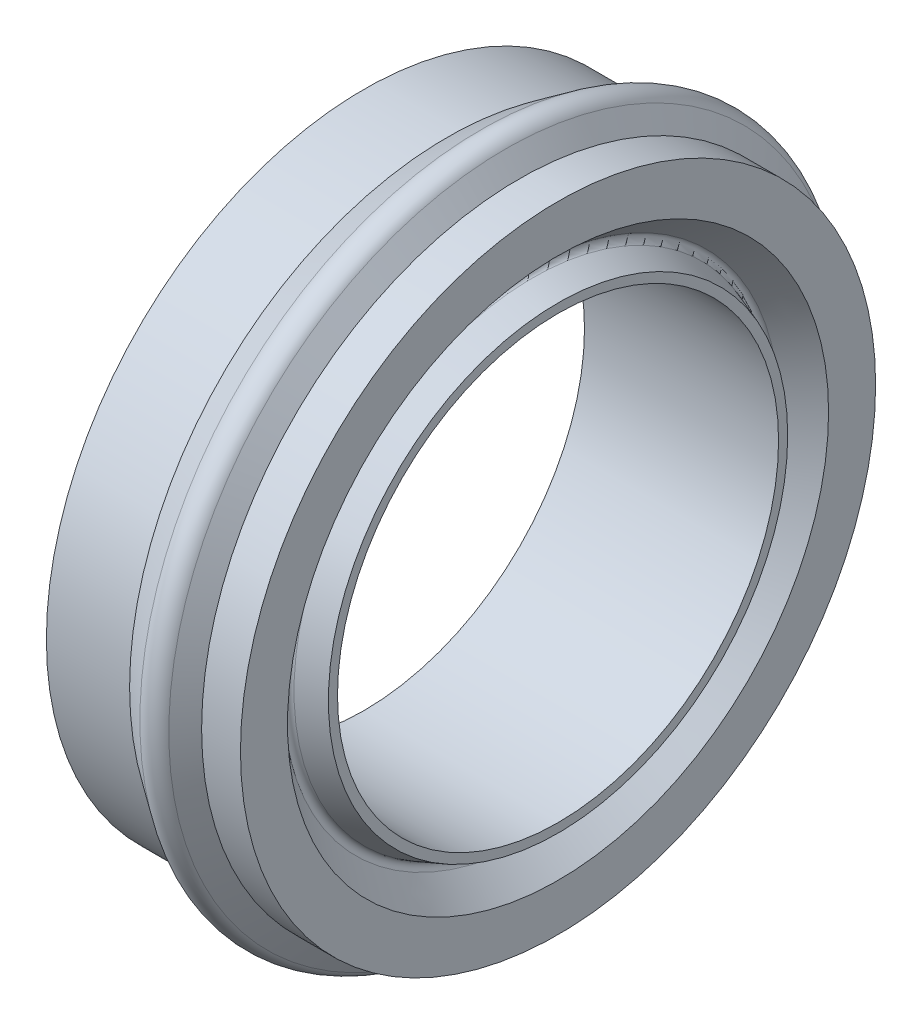
ISO-10303-21;
HEADER;
FILE_DESCRIPTION(('STEP AP214'),'2;1');
FILE_NAME('part.step','',(''),(''),'','','');
FILE_SCHEMA(('AUTOMOTIVE_DESIGN { 1 0 10303 214 1 1 1 1 }'));
ENDSEC;
DATA;
#1=APPLICATION_CONTEXT('core data for automotive mechanical design processes');
#2=APPLICATION_PROTOCOL_DEFINITION('international standard','automotive_design',2000,#1);
#3=PRODUCT_CONTEXT('',#1,'mechanical');
#4=PRODUCT('Part','Part','',(#3));
#5=PRODUCT_RELATED_PRODUCT_CATEGORY('part','',(#4));
#6=PRODUCT_DEFINITION_FORMATION('','',#4);
#7=PRODUCT_DEFINITION_CONTEXT('part definition',#1,'design');
#8=PRODUCT_DEFINITION('design','',#6,#7);
#9=PRODUCT_DEFINITION_SHAPE('','',#8);
#10=(LENGTH_UNIT() NAMED_UNIT(*) SI_UNIT(.MILLI.,.METRE.));
#11=(NAMED_UNIT(*) PLANE_ANGLE_UNIT() SI_UNIT($,.RADIAN.));
#12=(NAMED_UNIT(*) SI_UNIT($,.STERADIAN.) SOLID_ANGLE_UNIT());
#13=UNCERTAINTY_MEASURE_WITH_UNIT(LENGTH_MEASURE(1.E-05),#10,'distance_accuracy_value','');
#14=(GEOMETRIC_REPRESENTATION_CONTEXT(3) GLOBAL_UNCERTAINTY_ASSIGNED_CONTEXT((#13)) GLOBAL_UNIT_ASSIGNED_CONTEXT((#10,
#11,#12)) REPRESENTATION_CONTEXT('',''));
#15=CARTESIAN_POINT('',(0.,0.,0.));
#16=DIRECTION('',(0.,0.,1.));
#17=DIRECTION('',(1.,0.,0.));
#18=AXIS2_PLACEMENT_3D('',#15,#16,#17);
#19=CARTESIAN_POINT('',(12.8431908641816,0.,0.));
#20=DIRECTION('',(-1.,0.,0.));
#21=DIRECTION('',(0.,0.,1.));
#22=AXIS2_PLACEMENT_3D('',#19,#20,#21);
#23=CONICAL_SURFACE('',#22,16.7821846765844,0.721897734777882);
#24=CARTESIAN_POINT('',(15.2397348968309,0.,0.));
#25=DIRECTION('',(1.,0.,0.));
#26=DIRECTION('',(0.,0.,-1.));
#27=AXIS2_PLACEMENT_3D('',#24,#25,#26);
#28=CIRCLE('',#27,14.6721928607395);
#29=CARTESIAN_POINT('',(15.2397348968309,0.,-14.6721928607395));
#30=VERTEX_POINT('',#29);
#31=EDGE_CURVE('E83',#30,#30,#28,.T.);
#32=ORIENTED_EDGE('',*,*,#31,.T.);
#33=EDGE_LOOP('',(#32));
#34=FACE_BOUND('',#33,.T.);
#35=CARTESIAN_POINT('',(12.8431908641816,0.,0.));
#36=DIRECTION('',(1.,0.,0.));
#37=DIRECTION('',(0.,0.,-1.));
#38=AXIS2_PLACEMENT_3D('',#35,#36,#37);
#39=CIRCLE('',#38,16.7821846765844);
#40=CARTESIAN_POINT('',(12.8431908641816,0.,-16.7821846765844));
#41=VERTEX_POINT('',#40);
#42=EDGE_CURVE('E10',#41,#41,#39,.T.);
#43=ORIENTED_EDGE('',*,*,#42,.F.);
#44=EDGE_LOOP('',(#43));
#45=FACE_BOUND('',#44,.T.);
#46=ADVANCED_FACE('F31',(#34,#45),#23,.F.);
#47=CARTESIAN_POINT('',(12.8431908641816,18.,0.));
#48=DIRECTION('',(-1.,0.,0.));
#49=DIRECTION('',(0.,0.,1.));
#50=AXIS2_PLACEMENT_3D('',#47,#48,#49);
#51=PLANE('',#50);
#52=ORIENTED_EDGE('',*,*,#42,.T.);
#53=EDGE_LOOP('',(#52));
#54=FACE_BOUND('',#53,.T.);
#55=CARTESIAN_POINT('',(12.8431908641816,0.,0.));
#56=DIRECTION('',(1.,0.,0.));
#57=DIRECTION('',(0.,0.,-1.));
#58=AXIS2_PLACEMENT_3D('',#55,#56,#57);
#59=CIRCLE('',#58,18.);
#60=CARTESIAN_POINT('',(12.8431908641816,0.,-18.));
#61=VERTEX_POINT('',#60);
#62=EDGE_CURVE('E37',#61,#61,#59,.T.);
#63=ORIENTED_EDGE('',*,*,#62,.F.);
#64=EDGE_LOOP('',(#63));
#65=FACE_BOUND('',#64,.T.);
#66=ADVANCED_FACE('F101',(#54,#65),#51,.T.);
#67=CARTESIAN_POINT('',(29.1157823499387,0.,0.));
#68=DIRECTION('',(1.,0.,0.));
#69=DIRECTION('',(0.,0.,-1.));
#70=AXIS2_PLACEMENT_3D('',#67,#68,#69);
#71=CYLINDRICAL_SURFACE('',#70,18.);
#72=ORIENTED_EDGE('',*,*,#62,.T.);
#73=EDGE_LOOP('',(#72));
#74=FACE_BOUND('',#73,.T.);
#75=CARTESIAN_POINT('',(17.5598655159356,0.,0.));
#76=DIRECTION('',(1.,0.,0.));
#77=DIRECTION('',(0.,0.,-1.));
#78=AXIS2_PLACEMENT_3D('',#75,#76,#77);
#79=CIRCLE('',#78,18.);
#80=CARTESIAN_POINT('',(17.5598655159356,0.,-18.));
#81=VERTEX_POINT('',#80);
#82=EDGE_CURVE('E41',#81,#81,#79,.T.);
#83=ORIENTED_EDGE('',*,*,#82,.F.);
#84=EDGE_LOOP('',(#83));
#85=FACE_BOUND('',#84,.T.);
#86=ADVANCED_FACE('F105',(#74,#85),#71,.T.);
#87=CARTESIAN_POINT('',(19.4850863765066,0.,0.));
#88=DIRECTION('',(1.,0.,0.));
#89=DIRECTION('',(0.,0.,-1.));
#90=AXIS2_PLACEMENT_3D('',#87,#88,#89);
#91=CONICAL_SURFACE('',#90,19.3431712429728,0.609161333957169);
#92=ORIENTED_EDGE('',*,*,#82,.T.);
#93=EDGE_LOOP('',(#92));
#94=FACE_BOUND('',#93,.T.);
#95=CARTESIAN_POINT('',(19.4850863765066,0.,0.));
#96=DIRECTION('',(1.,0.,0.));
#97=DIRECTION('',(0.,0.,-1.));
#98=AXIS2_PLACEMENT_3D('',#95,#96,#97);
#99=CIRCLE('',#98,19.3431712429728);
#100=CARTESIAN_POINT('',(19.4850863765066,0.,-19.3431712429728));
#101=VERTEX_POINT('',#100);
#102=EDGE_CURVE('E45',#101,#101,#99,.T.);
#103=ORIENTED_EDGE('',*,*,#102,.F.);
#104=EDGE_LOOP('',(#103));
#105=FACE_BOUND('',#104,.T.);
#106=ADVANCED_FACE('F109',(#94,#105),#91,.T.);
#107=CARTESIAN_POINT('',(20.0572662242618,0.,0.));
#108=DIRECTION('',(1.,0.,0.));
#109=DIRECTION('',(0.,0.,-1.));
#110=AXIS2_PLACEMENT_3D('',#107,#108,#109);
#111=TOROIDAL_SURFACE('',#110,18.5230430689519,0.999999999999996);
#112=ORIENTED_EDGE('',*,*,#102,.T.);
#113=EDGE_LOOP('',(#112));
#114=FACE_BOUND('',#113,.T.);
#115=CARTESIAN_POINT('',(20.8773943982827,0.,0.));
#116=DIRECTION('',(1.,0.,0.));
#117=DIRECTION('',(0.,0.,-1.));
#118=AXIS2_PLACEMENT_3D('',#115,#116,#117);
#119=CIRCLE('',#118,19.0952229167071);
#120=CARTESIAN_POINT('',(20.8773943982827,0.,-19.0952229167071));
#121=VERTEX_POINT('',#120);
#122=EDGE_CURVE('E50',#121,#121,#119,.T.);
#123=ORIENTED_EDGE('',*,*,#122,.F.);
#124=EDGE_LOOP('',(#123));
#125=FACE_BOUND('',#124,.T.);
#126=ADVANCED_FACE('F115',(#114,#125),#111,.T.);
#127=CARTESIAN_POINT('',(21.6414999388436,0.,0.));
#128=DIRECTION('',(-1.,0.,0.));
#129=DIRECTION('',(0.,0.,1.));
#130=AXIS2_PLACEMENT_3D('',#127,#128,#129);
#131=CONICAL_SURFACE('',#130,18.,0.961634992837726);
#132=ORIENTED_EDGE('',*,*,#122,.T.);
#133=EDGE_LOOP('',(#132));
#134=FACE_BOUND('',#133,.T.);
#135=CARTESIAN_POINT('',(21.6414999388436,0.,0.));
#136=DIRECTION('',(1.,0.,0.));
#137=DIRECTION('',(0.,0.,-1.));
#138=AXIS2_PLACEMENT_3D('',#135,#136,#137);
#139=CIRCLE('',#138,18.);
#140=CARTESIAN_POINT('',(21.6414999388436,0.,-18.));
#141=VERTEX_POINT('',#140);
#142=EDGE_CURVE('E53',#141,#141,#139,.T.);
#143=ORIENTED_EDGE('',*,*,#142,.F.);
#144=EDGE_LOOP('',(#143));
#145=FACE_BOUND('',#144,.T.);
#146=ADVANCED_FACE('F119',(#134,#145),#131,.T.);
#147=CARTESIAN_POINT('',(29.1157823499387,0.,0.));
#148=DIRECTION('',(1.,0.,0.));
#149=DIRECTION('',(0.,0.,-1.));
#150=AXIS2_PLACEMENT_3D('',#147,#148,#149);
#151=CYLINDRICAL_SURFACE('',#150,18.);
#152=ORIENTED_EDGE('',*,*,#142,.T.);
#153=EDGE_LOOP('',(#152));
#154=FACE_BOUND('',#153,.T.);
#155=CARTESIAN_POINT('',(23.8431908641816,0.,0.));
#156=DIRECTION('',(1.,0.,0.));
#157=DIRECTION('',(0.,0.,-1.));
#158=AXIS2_PLACEMENT_3D('',#155,#156,#157);
#159=CIRCLE('',#158,18.);
#160=CARTESIAN_POINT('',(23.8431908641816,0.,-18.));
#161=VERTEX_POINT('',#160);
#162=EDGE_CURVE('E56',#161,#161,#159,.T.);
#163=ORIENTED_EDGE('',*,*,#162,.F.);
#164=EDGE_LOOP('',(#163));
#165=FACE_BOUND('',#164,.T.);
#166=ADVANCED_FACE('F123',(#154,#165),#151,.T.);
#167=CARTESIAN_POINT('',(23.8431908641816,15.3339387117938,0.));
#168=DIRECTION('',(1.,0.,0.));
#169=DIRECTION('',(0.,0.,-1.));
#170=AXIS2_PLACEMENT_3D('',#167,#168,#169);
#171=PLANE('',#170);
#172=ORIENTED_EDGE('',*,*,#162,.T.);
#173=EDGE_LOOP('',(#172));
#174=FACE_BOUND('',#173,.T.);
#175=CARTESIAN_POINT('',(23.8431908641816,0.,0.));
#176=DIRECTION('',(1.,0.,0.));
#177=DIRECTION('',(0.,0.,-1.));
#178=AXIS2_PLACEMENT_3D('',#175,#176,#177);
#179=CIRCLE('',#178,15.3339387117938);
#180=CARTESIAN_POINT('',(23.8431908641816,0.,-15.3339387117938));
#181=VERTEX_POINT('',#180);
#182=EDGE_CURVE('E59',#181,#181,#179,.T.);
#183=ORIENTED_EDGE('',*,*,#182,.F.);
#184=EDGE_LOOP('',(#183));
#185=FACE_BOUND('',#184,.T.);
#186=ADVANCED_FACE('F127',(#174,#185),#171,.T.);
#187=CARTESIAN_POINT('',(22.3229165200807,0.,0.));
#188=DIRECTION('',(1.,0.,0.));
#189=DIRECTION('',(0.,0.,-1.));
#190=AXIS2_PLACEMENT_3D('',#187,#188,#189);
#191=CONICAL_SURFACE('',#190,14.046297358895,0.702737949648893);
#192=ORIENTED_EDGE('',*,*,#182,.T.);
#193=EDGE_LOOP('',(#192));
#194=FACE_BOUND('',#193,.T.);
#195=CARTESIAN_POINT('',(22.3229165200807,0.,0.));
#196=DIRECTION('',(1.,0.,0.));
#197=DIRECTION('',(0.,0.,-1.));
#198=AXIS2_PLACEMENT_3D('',#195,#196,#197);
#199=CIRCLE('',#198,14.046297358895);
#200=CARTESIAN_POINT('',(22.3229165200807,0.,-14.046297358895));
#201=VERTEX_POINT('',#200);
#202=EDGE_CURVE('E62',#201,#201,#199,.T.);
#203=ORIENTED_EDGE('',*,*,#202,.F.);
#204=EDGE_LOOP('',(#203));
#205=FACE_BOUND('',#204,.T.);
#206=ADVANCED_FACE('F131',(#194,#205),#191,.F.);
#207=CARTESIAN_POINT('',(22.516809330893,0.,0.));
#208=DIRECTION('',(1.,0.,0.));
#209=DIRECTION('',(0.,0.,-1.));
#210=AXIS2_PLACEMENT_3D('',#207,#208,#209);
#211=TOROIDAL_SURFACE('',#210,13.817374712756,0.300000000000001);
#212=ORIENTED_EDGE('',*,*,#202,.T.);
#213=EDGE_LOOP('',(#212));
#214=FACE_BOUND('',#213,.T.);
#215=CARTESIAN_POINT('',(22.4145040662134,0.,0.));
#216=DIRECTION('',(1.,0.,0.));
#217=DIRECTION('',(0.,0.,-1.));
#218=AXIS2_PLACEMENT_3D('',#215,#216,#217);
#219=CIRCLE('',#218,13.5353576338071);
#220=CARTESIAN_POINT('',(22.4145040662134,0.,-13.5353576338071));
#221=VERTEX_POINT('',#220);
#222=EDGE_CURVE('E65',#221,#221,#219,.T.);
#223=ORIENTED_EDGE('',*,*,#222,.F.);
#224=EDGE_LOOP('',(#223));
#225=FACE_BOUND('',#224,.T.);
#226=ADVANCED_FACE('F135',(#214,#225),#211,.F.);
#227=CARTESIAN_POINT('',(23.8431908641816,0.,0.));
#228=DIRECTION('',(-1.,0.,0.));
#229=DIRECTION('',(0.,0.,1.));
#230=AXIS2_PLACEMENT_3D('',#227,#228,#229);
#231=CONICAL_SURFACE('',#230,13.0170834159649,0.347999118611848);
#232=ORIENTED_EDGE('',*,*,#222,.T.);
#233=EDGE_LOOP('',(#232));
#234=FACE_BOUND('',#233,.T.);
#235=CARTESIAN_POINT('',(23.8431908641816,0.,0.));
#236=DIRECTION('',(1.,0.,0.));
#237=DIRECTION('',(0.,0.,-1.));
#238=AXIS2_PLACEMENT_3D('',#235,#236,#237);
#239=CIRCLE('',#238,13.0170834159649);
#240=CARTESIAN_POINT('',(23.8431908641816,0.,-13.0170834159649));
#241=VERTEX_POINT('',#240);
#242=EDGE_CURVE('E68',#241,#241,#239,.T.);
#243=ORIENTED_EDGE('',*,*,#242,.F.);
#244=EDGE_LOOP('',(#243));
#245=FACE_BOUND('',#244,.T.);
#246=ADVANCED_FACE('F139',(#234,#245),#231,.T.);
#247=CARTESIAN_POINT('',(23.8431908641816,12.5,0.));
#248=DIRECTION('',(1.,0.,0.));
#249=DIRECTION('',(0.,0.,-1.));
#250=AXIS2_PLACEMENT_3D('',#247,#248,#249);
#251=PLANE('',#250);
#252=ORIENTED_EDGE('',*,*,#242,.T.);
#253=EDGE_LOOP('',(#252));
#254=FACE_BOUND('',#253,.T.);
#255=CARTESIAN_POINT('',(23.8431908641816,0.,0.));
#256=DIRECTION('',(1.,0.,0.));
#257=DIRECTION('',(0.,0.,-1.));
#258=AXIS2_PLACEMENT_3D('',#255,#256,#257);
#259=CIRCLE('',#258,12.5);
#260=CARTESIAN_POINT('',(23.8431908641816,0.,-12.5));
#261=VERTEX_POINT('',#260);
#262=EDGE_CURVE('E71',#261,#261,#259,.T.);
#263=ORIENTED_EDGE('',*,*,#262,.F.);
#264=EDGE_LOOP('',(#263));
#265=FACE_BOUND('',#264,.T.);
#266=ADVANCED_FACE('F143',(#254,#265),#251,.T.);
#267=CARTESIAN_POINT('',(29.1157823499387,0.,0.));
#268=DIRECTION('',(1.,0.,0.));
#269=DIRECTION('',(0.,0.,-1.));
#270=AXIS2_PLACEMENT_3D('',#267,#268,#269);
#271=CYLINDRICAL_SURFACE('',#270,12.5);
#272=ORIENTED_EDGE('',*,*,#262,.T.);
#273=EDGE_LOOP('',(#272));
#274=FACE_BOUND('',#273,.T.);
#275=CARTESIAN_POINT('',(12.8431908641816,0.,0.));
#276=DIRECTION('',(1.,0.,0.));
#277=DIRECTION('',(0.,0.,-1.));
#278=AXIS2_PLACEMENT_3D('',#275,#276,#277);
#279=CIRCLE('',#278,12.5);
#280=CARTESIAN_POINT('',(12.8431908641816,0.,-12.5));
#281=VERTEX_POINT('',#280);
#282=EDGE_CURVE('E74',#281,#281,#279,.T.);
#283=ORIENTED_EDGE('',*,*,#282,.F.);
#284=EDGE_LOOP('',(#283));
#285=FACE_BOUND('',#284,.T.);
#286=ADVANCED_FACE('F147',(#274,#285),#271,.F.);
#287=CARTESIAN_POINT('',(12.8431908641816,13.1656549011957,0.));
#288=DIRECTION('',(-1.,0.,0.));
#289=DIRECTION('',(0.,0.,1.));
#290=AXIS2_PLACEMENT_3D('',#287,#288,#289);
#291=PLANE('',#290);
#292=ORIENTED_EDGE('',*,*,#282,.T.);
#293=EDGE_LOOP('',(#292));
#294=FACE_BOUND('',#293,.T.);
#295=CARTESIAN_POINT('',(12.8431908641816,0.,0.));
#296=DIRECTION('',(1.,0.,0.));
#297=DIRECTION('',(0.,0.,-1.));
#298=AXIS2_PLACEMENT_3D('',#295,#296,#297);
#299=CIRCLE('',#298,13.1656549011957);
#300=CARTESIAN_POINT('',(12.8431908641816,0.,-13.1656549011957));
#301=VERTEX_POINT('',#300);
#302=EDGE_CURVE('E77',#301,#301,#299,.T.);
#303=ORIENTED_EDGE('',*,*,#302,.F.);
#304=EDGE_LOOP('',(#303));
#305=FACE_BOUND('',#304,.T.);
#306=ADVANCED_FACE('F97',(#294,#305),#291,.T.);
#307=CARTESIAN_POINT('',(15.0508918851599,0.,0.));
#308=DIRECTION('',(1.,0.,0.));
#309=DIRECTION('',(0.,0.,-1.));
#310=AXIS2_PLACEMENT_3D('',#307,#308,#309);
#311=CONICAL_SURFACE('',#310,13.817374712756,0.287050023747089);
#312=ORIENTED_EDGE('',*,*,#302,.T.);
#313=EDGE_LOOP('',(#312));
#314=FACE_BOUND('',#313,.T.);
#315=CARTESIAN_POINT('',(15.0508918851599,0.,0.));
#316=DIRECTION('',(1.,0.,0.));
#317=DIRECTION('',(0.,0.,-1.));
#318=AXIS2_PLACEMENT_3D('',#315,#316,#317);
#319=CIRCLE('',#318,13.817374712756);
#320=CARTESIAN_POINT('',(15.0508918851599,0.,-13.817374712756));
#321=VERTEX_POINT('',#320);
#322=EDGE_CURVE('E80',#321,#321,#319,.T.);
#323=ORIENTED_EDGE('',*,*,#322,.F.);
#324=EDGE_LOOP('',(#323));
#325=FACE_BOUND('',#324,.T.);
#326=ADVANCED_FACE('F91',(#314,#325),#311,.T.);
#327=CARTESIAN_POINT('',(14.9093297910105,0.,0.));
#328=DIRECTION('',(1.,0.,0.));
#329=DIRECTION('',(0.,0.,-1.));
#330=AXIS2_PLACEMENT_3D('',#327,#328,#329);
#331=TOROIDAL_SURFACE('',#330,14.2969163412931,0.499999999999999);
#332=ORIENTED_EDGE('',*,*,#322,.T.);
#333=EDGE_LOOP('',(#332));
#334=FACE_BOUND('',#333,.T.);
#335=ORIENTED_EDGE('',*,*,#31,.F.);
#336=EDGE_LOOP('',(#335));
#337=FACE_BOUND('',#336,.T.);
#338=ADVANCED_FACE('F89',(#334,#337),#331,.F.);
#339=CLOSED_SHELL('',(#46,#66,#86,#106,#126,#146,#166,#186,#206,#226,#246,#266,#286,#306,#326,#338));
#340=MANIFOLD_SOLID_BREP('B2',#339);
#341=ADVANCED_BREP_SHAPE_REPRESENTATION('',(#18,#340),#14);
#342=SHAPE_DEFINITION_REPRESENTATION(#9,#341);
ENDSEC;
END-ISO-10303-21;
